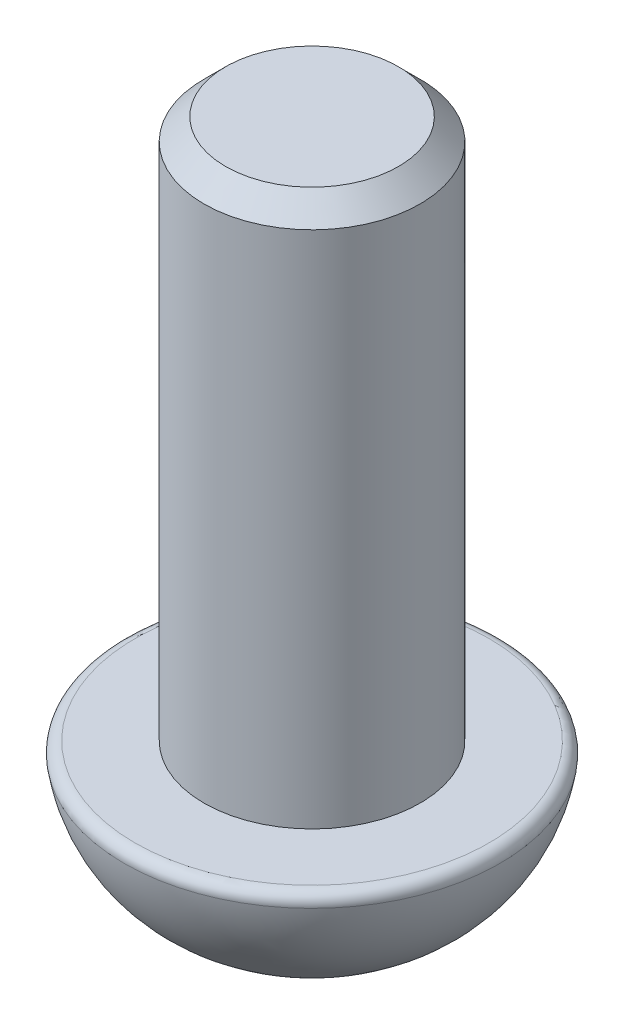
ISO-10303-21;
HEADER;
FILE_DESCRIPTION(('STEP AP214'),'2;1');
FILE_NAME('part.step','',(''),(''),'','','');
FILE_SCHEMA(('AUTOMOTIVE_DESIGN { 1 0 10303 214 1 1 1 1 }'));
ENDSEC;
DATA;
#1=APPLICATION_CONTEXT('core data for automotive mechanical design processes');
#2=APPLICATION_PROTOCOL_DEFINITION('international standard','automotive_design',2000,#1);
#3=PRODUCT_CONTEXT('',#1,'mechanical');
#4=PRODUCT('Part','Part','',(#3));
#5=PRODUCT_RELATED_PRODUCT_CATEGORY('part','',(#4));
#6=PRODUCT_DEFINITION_FORMATION('','',#4);
#7=PRODUCT_DEFINITION_CONTEXT('part definition',#1,'design');
#8=PRODUCT_DEFINITION('design','',#6,#7);
#9=PRODUCT_DEFINITION_SHAPE('','',#8);
#10=(LENGTH_UNIT() NAMED_UNIT(*) SI_UNIT(.MILLI.,.METRE.));
#11=(NAMED_UNIT(*) PLANE_ANGLE_UNIT() SI_UNIT($,.RADIAN.));
#12=(NAMED_UNIT(*) SI_UNIT($,.STERADIAN.) SOLID_ANGLE_UNIT());
#13=UNCERTAINTY_MEASURE_WITH_UNIT(LENGTH_MEASURE(1.E-05),#10,'distance_accuracy_value','');
#14=(GEOMETRIC_REPRESENTATION_CONTEXT(3) GLOBAL_UNCERTAINTY_ASSIGNED_CONTEXT((#13)) GLOBAL_UNIT_ASSIGNED_CONTEXT((#10,
#11,#12)) REPRESENTATION_CONTEXT('',''));
#15=CARTESIAN_POINT('',(0.,0.,0.));
#16=DIRECTION('',(0.,0.,1.));
#17=DIRECTION('',(1.,0.,0.));
#18=AXIS2_PLACEMENT_3D('',#15,#16,#17);
#19=CARTESIAN_POINT('',(0.,1.3,0.));
#20=DIRECTION('',(0.,1.,0.));
#21=DIRECTION('',(0.,0.,1.));
#22=AXIS2_PLACEMENT_3D('',#19,#20,#21);
#23=PLANE('',#22);
#24=CARTESIAN_POINT('',(0.,1.3,0.));
#25=DIRECTION('',(0.,1.,0.));
#26=DIRECTION('',(0.,0.,1.));
#27=AXIS2_PLACEMENT_3D('',#24,#25,#26);
#28=CIRCLE('',#27,1.63776121154421);
#29=CARTESIAN_POINT('',(0.,1.3,1.63776121154421));
#30=VERTEX_POINT('',#29);
#31=EDGE_CURVE('E60',#30,#30,#28,.T.);
#32=ORIENTED_EDGE('',*,*,#31,.T.);
#33=EDGE_LOOP('',(#32));
#34=FACE_BOUND('',#33,.T.);
#35=CARTESIAN_POINT('',(0.,1.3,0.));
#36=DIRECTION('',(0.,1.,0.));
#37=DIRECTION('',(0.,0.,1.));
#38=AXIS2_PLACEMENT_3D('',#35,#36,#37);
#39=CIRCLE('',#38,1.);
#40=CARTESIAN_POINT('',(0.,1.3,1.));
#41=VERTEX_POINT('',#40);
#42=EDGE_CURVE('E148',#41,#41,#39,.T.);
#43=ORIENTED_EDGE('',*,*,#42,.F.);
#44=EDGE_LOOP('',(#43));
#45=FACE_BOUND('',#44,.T.);
#46=ADVANCED_FACE('F51',(#34,#45),#23,.T.);
#47=CARTESIAN_POINT('',(0.,6.3,0.));
#48=DIRECTION('',(0.,-1.,0.));
#49=DIRECTION('',(0.,0.,-1.));
#50=AXIS2_PLACEMENT_3D('',#47,#48,#49);
#51=CYLINDRICAL_SURFACE('',#50,1.);
#52=CARTESIAN_POINT('',(0.,6.1,0.));
#53=DIRECTION('',(0.,1.,0.));
#54=DIRECTION('',(0.,0.,1.));
#55=AXIS2_PLACEMENT_3D('',#52,#53,#54);
#56=CIRCLE('',#55,1.);
#57=CARTESIAN_POINT('',(0.,6.1,1.));
#58=VERTEX_POINT('',#57);
#59=EDGE_CURVE('E163',#58,#58,#56,.F.);
#60=ORIENTED_EDGE('',*,*,#59,.T.);
#61=EDGE_LOOP('',(#60));
#62=FACE_BOUND('',#61,.T.);
#63=ORIENTED_EDGE('',*,*,#42,.T.);
#64=EDGE_LOOP('',(#63));
#65=FACE_BOUND('',#64,.T.);
#66=ADVANCED_FACE('F180',(#62,#65),#51,.T.);
#67=CARTESIAN_POINT('',(0.,6.3,0.));
#68=DIRECTION('',(0.,1.,0.));
#69=DIRECTION('',(0.,0.,1.));
#70=AXIS2_PLACEMENT_3D('',#67,#68,#69);
#71=PLANE('',#70);
#72=CARTESIAN_POINT('',(0.,6.3,0.));
#73=DIRECTION('',(0.,1.,0.));
#74=DIRECTION('',(0.,0.,1.));
#75=AXIS2_PLACEMENT_3D('',#72,#73,#74);
#76=CIRCLE('',#75,0.799999999999999);
#77=CARTESIAN_POINT('',(0.,6.3,0.799999999999999));
#78=VERTEX_POINT('',#77);
#79=EDGE_CURVE('E160',#78,#78,#76,.T.);
#80=ORIENTED_EDGE('',*,*,#79,.T.);
#81=EDGE_LOOP('',(#80));
#82=FACE_BOUND('',#81,.T.);
#83=ADVANCED_FACE('F185',(#82),#71,.T.);
#84=CARTESIAN_POINT('',(0.,6.3,0.));
#85=DIRECTION('',(0.,-1.,0.));
#86=DIRECTION('',(0.,0.,-1.));
#87=AXIS2_PLACEMENT_3D('',#84,#85,#86);
#88=CONICAL_SURFACE('',#87,0.799999999999999,0.785398163397448);
#89=ORIENTED_EDGE('',*,*,#59,.F.);
#90=EDGE_LOOP('',(#89));
#91=FACE_BOUND('',#90,.T.);
#92=ORIENTED_EDGE('',*,*,#79,.F.);
#93=EDGE_LOOP('',(#92));
#94=FACE_BOUND('',#93,.T.);
#95=ADVANCED_FACE('F190',(#91,#94),#88,.T.);
#96=CARTESIAN_POINT('',(0.,1.41558806402646,0.));
#97=DIRECTION('',(0.,1.,0.));
#98=DIRECTION('',(0.,0.,1.));
#99=AXIS2_PLACEMENT_3D('',#96,#97,#98);
#100=DEGENERATE_TOROIDAL_SURFACE('',#99,0.254460164537696,1.5,.T.);
#101=CARTESIAN_POINT('',(0.,1.18460085256954,0.));
#102=DIRECTION('',(0.,1.,0.));
#103=DIRECTION('',(0.,0.,1.));
#104=AXIS2_PLACEMENT_3D('',#101,#102,#103);
#105=CIRCLE('',#104,1.73656842918753);
#106=CARTESIAN_POINT('',(0.,1.18460085256954,1.73656842918753));
#107=VERTEX_POINT('',#106);
#108=EDGE_CURVE('E11',#107,#107,#105,.F.);
#109=ORIENTED_EDGE('',*,*,#108,.T.);
#110=EDGE_LOOP('',(#109));
#111=FACE_BOUND('',#110,.T.);
#112=CARTESIAN_POINT('',(0.,0.,0.));
#113=DIRECTION('',(0.,1.,0.));
#114=DIRECTION('',(0.,0.,1.));
#115=AXIS2_PLACEMENT_3D('',#112,#113,#114);
#116=CIRCLE('',#115,0.750555349946514);
#117=CARTESIAN_POINT('',(0.,0.,0.750555349946514));
#118=VERTEX_POINT('',#117);
#119=CARTESIAN_POINT('',(0.65,0.,0.375277674973258));
#120=VERTEX_POINT('',#119);
#121=EDGE_CURVE('E104',#118,#120,#116,.T.);
#122=ORIENTED_EDGE('',*,*,#121,.T.);
#123=CARTESIAN_POINT('',(0.650000000000001,0.,-0.375277674973257));
#124=VERTEX_POINT('',#123);
#125=EDGE_CURVE('E119',#120,#124,#116,.T.);
#126=ORIENTED_EDGE('',*,*,#125,.T.);
#127=CARTESIAN_POINT('',(0.,0.,-0.750555349946514));
#128=VERTEX_POINT('',#127);
#129=EDGE_CURVE('E262',#124,#128,#116,.T.);
#130=ORIENTED_EDGE('',*,*,#129,.T.);
#131=CARTESIAN_POINT('',(-0.65,0.,-0.375277674973257));
#132=VERTEX_POINT('',#131);
#133=EDGE_CURVE('E263',#128,#132,#116,.T.);
#134=ORIENTED_EDGE('',*,*,#133,.T.);
#135=CARTESIAN_POINT('',(-0.65,0.,0.375277674973257));
#136=VERTEX_POINT('',#135);
#137=EDGE_CURVE('E107',#132,#136,#116,.T.);
#138=ORIENTED_EDGE('',*,*,#137,.T.);
#139=EDGE_CURVE('E101',#136,#118,#116,.T.);
#140=ORIENTED_EDGE('',*,*,#139,.T.);
#141=EDGE_LOOP('',(#122,#126,#130,#134,#138,#140));
#142=FACE_BOUND('',#141,.T.);
#143=ADVANCED_FACE('F103',(#111,#142),#100,.T.);
#144=CARTESIAN_POINT('',(0.,0.8,0.));
#145=DIRECTION('',(0.,-1.,0.));
#146=DIRECTION('',(0.,0.,-1.));
#147=AXIS2_PLACEMENT_3D('',#144,#145,#146);
#148=PLANE('',#147);
#149=DIRECTION('',(0.866025403784438,0.,-0.5));
#150=VECTOR('',#149,1.);
#151=CARTESIAN_POINT('',(-0.65,0.8,-0.375277674973257));
#152=LINE('',#151,#150);
#153=CARTESIAN_POINT('',(-0.65,0.8,-0.375277674973257));
#154=VERTEX_POINT('',#153);
#155=CARTESIAN_POINT('',(0.,0.8,-0.750555349946514));
#156=VERTEX_POINT('',#155);
#157=EDGE_CURVE('E143',#154,#156,#152,.T.);
#158=ORIENTED_EDGE('',*,*,#157,.T.);
#159=DIRECTION('',(0.866025403784438,0.,0.5));
#160=VECTOR('',#159,1.);
#161=CARTESIAN_POINT('',(0.,0.8,-0.750555349946514));
#162=LINE('',#161,#160);
#163=CARTESIAN_POINT('',(0.65,0.8,-0.375277674973257));
#164=VERTEX_POINT('',#163);
#165=EDGE_CURVE('E244',#156,#164,#162,.T.);
#166=ORIENTED_EDGE('',*,*,#165,.T.);
#167=DIRECTION('',(0.,0.,1.));
#168=VECTOR('',#167,1.);
#169=CARTESIAN_POINT('',(0.65,0.8,-0.375277674973257));
#170=LINE('',#169,#168);
#171=CARTESIAN_POINT('',(0.65,0.8,0.375277674973258));
#172=VERTEX_POINT('',#171);
#173=EDGE_CURVE('E246',#164,#172,#170,.T.);
#174=ORIENTED_EDGE('',*,*,#173,.T.);
#175=DIRECTION('',(-0.866025403784439,0.,0.5));
#176=VECTOR('',#175,1.);
#177=CARTESIAN_POINT('',(0.65,0.8,0.375277674973258));
#178=LINE('',#177,#176);
#179=CARTESIAN_POINT('',(0.,0.8,0.750555349946514));
#180=VERTEX_POINT('',#179);
#181=EDGE_CURVE('E250',#172,#180,#178,.T.);
#182=ORIENTED_EDGE('',*,*,#181,.T.);
#183=DIRECTION('',(-0.866025403784438,0.,-0.5));
#184=VECTOR('',#183,1.);
#185=CARTESIAN_POINT('',(0.,0.8,0.750555349946514));
#186=LINE('',#185,#184);
#187=CARTESIAN_POINT('',(-0.65,0.8,0.375277674973257));
#188=VERTEX_POINT('',#187);
#189=EDGE_CURVE('E128',#180,#188,#186,.T.);
#190=ORIENTED_EDGE('',*,*,#189,.T.);
#191=DIRECTION('',(0.,0.,-1.));
#192=VECTOR('',#191,1.);
#193=CARTESIAN_POINT('',(-0.65,0.8,0.375277674973257));
#194=LINE('',#193,#192);
#195=EDGE_CURVE('E157',#188,#154,#194,.T.);
#196=ORIENTED_EDGE('',*,*,#195,.T.);
#197=EDGE_LOOP('',(#158,#166,#174,#182,#190,#196));
#198=FACE_BOUND('',#197,.T.);
#199=ADVANCED_FACE('F199',(#198),#148,.T.);
#200=CARTESIAN_POINT('',(0.,0.8,0.750555349946514));
#201=DIRECTION('',(-0.5,0.,0.866025403784438));
#202=DIRECTION('',(0.866025403784439,0.,0.5));
#203=AXIS2_PLACEMENT_3D('',#200,#201,#202);
#204=PLANE('',#203);
#205=DIRECTION('',(-0.866025403784438,0.,-0.5));
#206=VECTOR('',#205,1.);
#207=CARTESIAN_POINT('',(0.,0.,0.750555349946514));
#208=LINE('',#207,#206);
#209=EDGE_CURVE('E125',#118,#136,#208,.T.);
#210=ORIENTED_EDGE('',*,*,#209,.T.);
#211=DIRECTION('',(0.,-1.,0.));
#212=VECTOR('',#211,1.);
#213=CARTESIAN_POINT('',(-0.65,0.8,0.375277674973257));
#214=LINE('',#213,#212);
#215=EDGE_CURVE('E132',#188,#136,#214,.T.);
#216=ORIENTED_EDGE('',*,*,#215,.F.);
#217=ORIENTED_EDGE('',*,*,#189,.F.);
#218=DIRECTION('',(0.,-1.,0.));
#219=VECTOR('',#218,1.);
#220=CARTESIAN_POINT('',(0.,0.8,0.750555349946514));
#221=LINE('',#220,#219);
#222=EDGE_CURVE('E123',#180,#118,#221,.T.);
#223=ORIENTED_EDGE('',*,*,#222,.T.);
#224=EDGE_LOOP('',(#210,#216,#217,#223));
#225=FACE_BOUND('',#224,.T.);
#226=ADVANCED_FACE('F124',(#225),#204,.F.);
#227=CARTESIAN_POINT('',(0.,0.,0.));
#228=DIRECTION('',(0.,1.,0.));
#229=DIRECTION('',(0.,0.,1.));
#230=AXIS2_PLACEMENT_3D('',#227,#228,#229);
#231=PLANE('',#230);
#232=ORIENTED_EDGE('',*,*,#139,.F.);
#233=ORIENTED_EDGE('',*,*,#209,.F.);
#234=EDGE_LOOP('',(#232,#233));
#235=FACE_BOUND('',#234,.T.);
#236=ADVANCED_FACE('F140',(#235),#231,.F.);
#237=CARTESIAN_POINT('',(-0.65,0.8,0.375277674973257));
#238=DIRECTION('',(-1.,0.,0.));
#239=DIRECTION('',(0.,0.,1.));
#240=AXIS2_PLACEMENT_3D('',#237,#238,#239);
#241=PLANE('',#240);
#242=DIRECTION('',(0.,0.,-1.));
#243=VECTOR('',#242,1.);
#244=CARTESIAN_POINT('',(-0.65,0.,0.375277674973257));
#245=LINE('',#244,#243);
#246=EDGE_CURVE('E141',#136,#132,#245,.T.);
#247=ORIENTED_EDGE('',*,*,#246,.T.);
#248=DIRECTION('',(0.,-1.,0.));
#249=VECTOR('',#248,1.);
#250=CARTESIAN_POINT('',(-0.65,0.8,-0.375277674973257));
#251=LINE('',#250,#249);
#252=EDGE_CURVE('E67',#154,#132,#251,.T.);
#253=ORIENTED_EDGE('',*,*,#252,.F.);
#254=ORIENTED_EDGE('',*,*,#195,.F.);
#255=ORIENTED_EDGE('',*,*,#215,.T.);
#256=EDGE_LOOP('',(#247,#253,#254,#255));
#257=FACE_BOUND('',#256,.T.);
#258=ADVANCED_FACE('F232',(#257),#241,.F.);
#259=ORIENTED_EDGE('',*,*,#137,.F.);
#260=ORIENTED_EDGE('',*,*,#246,.F.);
#261=EDGE_LOOP('',(#259,#260));
#262=FACE_BOUND('',#261,.T.);
#263=ADVANCED_FACE('F217',(#262),#231,.F.);
#264=CARTESIAN_POINT('',(-0.65,0.8,-0.375277674973257));
#265=DIRECTION('',(-0.5,0.,-0.866025403784438));
#266=DIRECTION('',(-0.866025403784439,0.,0.5));
#267=AXIS2_PLACEMENT_3D('',#264,#265,#266);
#268=PLANE('',#267);
#269=DIRECTION('',(0.866025403784438,0.,-0.5));
#270=VECTOR('',#269,1.);
#271=CARTESIAN_POINT('',(-0.65,0.,-0.375277674973257));
#272=LINE('',#271,#270);
#273=EDGE_CURVE('E118',#132,#128,#272,.T.);
#274=ORIENTED_EDGE('',*,*,#273,.T.);
#275=DIRECTION('',(0.,-1.,0.));
#276=VECTOR('',#275,1.);
#277=CARTESIAN_POINT('',(0.,0.8,-0.750555349946514));
#278=LINE('',#277,#276);
#279=EDGE_CURVE('E154',#156,#128,#278,.T.);
#280=ORIENTED_EDGE('',*,*,#279,.F.);
#281=ORIENTED_EDGE('',*,*,#157,.F.);
#282=ORIENTED_EDGE('',*,*,#252,.T.);
#283=EDGE_LOOP('',(#274,#280,#281,#282));
#284=FACE_BOUND('',#283,.T.);
#285=ADVANCED_FACE('F213',(#284),#268,.F.);
#286=ORIENTED_EDGE('',*,*,#133,.F.);
#287=ORIENTED_EDGE('',*,*,#273,.F.);
#288=EDGE_LOOP('',(#286,#287));
#289=FACE_BOUND('',#288,.T.);
#290=ADVANCED_FACE('F216',(#289),#231,.F.);
#291=CARTESIAN_POINT('',(0.,0.8,-0.750555349946514));
#292=DIRECTION('',(0.5,0.,-0.866025403784438));
#293=DIRECTION('',(-0.866025403784439,0.,-0.5));
#294=AXIS2_PLACEMENT_3D('',#291,#292,#293);
#295=PLANE('',#294);
#296=DIRECTION('',(0.866025403784438,0.,0.5));
#297=VECTOR('',#296,1.);
#298=CARTESIAN_POINT('',(0.,0.,-0.750555349946514));
#299=LINE('',#298,#297);
#300=EDGE_CURVE('E256',#128,#124,#299,.T.);
#301=ORIENTED_EDGE('',*,*,#300,.T.);
#302=DIRECTION('',(0.,-1.,0.));
#303=VECTOR('',#302,1.);
#304=CARTESIAN_POINT('',(0.65,0.8,-0.375277674973257));
#305=LINE('',#304,#303);
#306=EDGE_CURVE('E151',#164,#124,#305,.T.);
#307=ORIENTED_EDGE('',*,*,#306,.F.);
#308=ORIENTED_EDGE('',*,*,#165,.F.);
#309=ORIENTED_EDGE('',*,*,#279,.T.);
#310=EDGE_LOOP('',(#301,#307,#308,#309));
#311=FACE_BOUND('',#310,.T.);
#312=ADVANCED_FACE('F219',(#311),#295,.F.);
#313=ORIENTED_EDGE('',*,*,#129,.F.);
#314=ORIENTED_EDGE('',*,*,#300,.F.);
#315=EDGE_LOOP('',(#313,#314));
#316=FACE_BOUND('',#315,.T.);
#317=ADVANCED_FACE('F222',(#316),#231,.F.);
#318=CARTESIAN_POINT('',(0.65,0.8,-0.375277674973257));
#319=DIRECTION('',(1.,0.,0.));
#320=DIRECTION('',(0.,0.,-1.));
#321=AXIS2_PLACEMENT_3D('',#318,#319,#320);
#322=PLANE('',#321);
#323=DIRECTION('',(0.,0.,1.));
#324=VECTOR('',#323,1.);
#325=CARTESIAN_POINT('',(0.65,0.,-0.375277674973257));
#326=LINE('',#325,#324);
#327=EDGE_CURVE('E138',#124,#120,#326,.T.);
#328=ORIENTED_EDGE('',*,*,#327,.T.);
#329=DIRECTION('',(0.,-1.,0.));
#330=VECTOR('',#329,1.);
#331=CARTESIAN_POINT('',(0.65,0.8,0.375277674973258));
#332=LINE('',#331,#330);
#333=EDGE_CURVE('E133',#172,#120,#332,.T.);
#334=ORIENTED_EDGE('',*,*,#333,.F.);
#335=ORIENTED_EDGE('',*,*,#173,.F.);
#336=ORIENTED_EDGE('',*,*,#306,.T.);
#337=EDGE_LOOP('',(#328,#334,#335,#336));
#338=FACE_BOUND('',#337,.T.);
#339=ADVANCED_FACE('F224',(#338),#322,.F.);
#340=ORIENTED_EDGE('',*,*,#125,.F.);
#341=ORIENTED_EDGE('',*,*,#327,.F.);
#342=EDGE_LOOP('',(#340,#341));
#343=FACE_BOUND('',#342,.T.);
#344=ADVANCED_FACE('F177',(#343),#231,.F.);
#345=CARTESIAN_POINT('',(0.65,0.8,0.375277674973258));
#346=DIRECTION('',(0.5,0.,0.866025403784438));
#347=DIRECTION('',(0.866025403784439,0.,-0.5));
#348=AXIS2_PLACEMENT_3D('',#345,#346,#347);
#349=PLANE('',#348);
#350=DIRECTION('',(-0.866025403784439,0.,0.5));
#351=VECTOR('',#350,1.);
#352=CARTESIAN_POINT('',(0.65,0.,0.375277674973258));
#353=LINE('',#352,#351);
#354=EDGE_CURVE('E117',#120,#118,#353,.T.);
#355=ORIENTED_EDGE('',*,*,#354,.T.);
#356=ORIENTED_EDGE('',*,*,#222,.F.);
#357=ORIENTED_EDGE('',*,*,#181,.F.);
#358=ORIENTED_EDGE('',*,*,#333,.T.);
#359=EDGE_LOOP('',(#355,#356,#357,#358));
#360=FACE_BOUND('',#359,.T.);
#361=ADVANCED_FACE('F136',(#360),#349,.F.);
#362=ORIENTED_EDGE('',*,*,#121,.F.);
#363=ORIENTED_EDGE('',*,*,#354,.F.);
#364=EDGE_LOOP('',(#362,#363));
#365=FACE_BOUND('',#364,.T.);
#366=ADVANCED_FACE('F115',(#365),#231,.F.);
#367=CARTESIAN_POINT('',(0.,1.2,0.));
#368=DIRECTION('',(0.,1.,0.));
#369=DIRECTION('',(0.,0.,1.));
#370=AXIS2_PLACEMENT_3D('',#367,#368,#369);
#371=TOROIDAL_SURFACE('',#370,1.63776121154421,0.1);
#372=ORIENTED_EDGE('',*,*,#108,.F.);
#373=EDGE_LOOP('',(#372));
#374=FACE_BOUND('',#373,.T.);
#375=ORIENTED_EDGE('',*,*,#31,.F.);
#376=EDGE_LOOP('',(#375));
#377=FACE_BOUND('',#376,.T.);
#378=ADVANCED_FACE('F53',(#374,#377),#371,.T.);
#379=CLOSED_SHELL('',(#46,#66,#83,#95,#143,#199,#226,#236,#258,#263,#285,#290,#312,#317,#339,
#344,#361,#366,#378));
#380=MANIFOLD_SOLID_BREP('B2',#379);
#381=ADVANCED_BREP_SHAPE_REPRESENTATION('',(#18,#380),#14);
#382=SHAPE_DEFINITION_REPRESENTATION(#9,#381);
ENDSEC;
END-ISO-10303-21;
